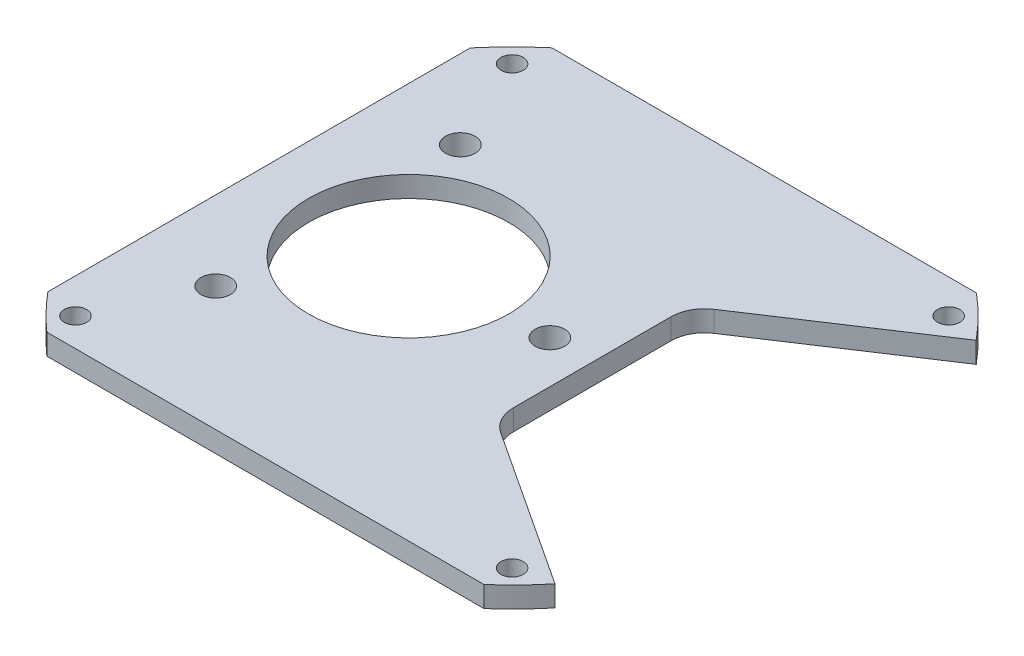
ISO-10303-21;
HEADER;
FILE_DESCRIPTION(('STEP AP214'),'2;1');
FILE_NAME('part.step','',(''),(''),'','','');
FILE_SCHEMA(('AUTOMOTIVE_DESIGN { 1 0 10303 214 1 1 1 1 }'));
ENDSEC;
DATA;
#1=APPLICATION_CONTEXT('core data for automotive mechanical design processes');
#2=APPLICATION_PROTOCOL_DEFINITION('international standard','automotive_design',2000,#1);
#3=PRODUCT_CONTEXT('',#1,'mechanical');
#4=PRODUCT('Part','Part','',(#3));
#5=PRODUCT_RELATED_PRODUCT_CATEGORY('part','',(#4));
#6=PRODUCT_DEFINITION_FORMATION('','',#4);
#7=PRODUCT_DEFINITION_CONTEXT('part definition',#1,'design');
#8=PRODUCT_DEFINITION('design','',#6,#7);
#9=PRODUCT_DEFINITION_SHAPE('','',#8);
#10=(LENGTH_UNIT() NAMED_UNIT(*) SI_UNIT(.MILLI.,.METRE.));
#11=(NAMED_UNIT(*) PLANE_ANGLE_UNIT() SI_UNIT($,.RADIAN.));
#12=(NAMED_UNIT(*) SI_UNIT($,.STERADIAN.) SOLID_ANGLE_UNIT());
#13=UNCERTAINTY_MEASURE_WITH_UNIT(LENGTH_MEASURE(1.E-05),#10,'distance_accuracy_value','');
#14=(GEOMETRIC_REPRESENTATION_CONTEXT(3) GLOBAL_UNCERTAINTY_ASSIGNED_CONTEXT((#13)) GLOBAL_UNIT_ASSIGNED_CONTEXT((#10,
#11,#12)) REPRESENTATION_CONTEXT('',''));
#15=CARTESIAN_POINT('',(0.,0.,0.));
#16=DIRECTION('',(0.,0.,1.));
#17=DIRECTION('',(1.,0.,0.));
#18=AXIS2_PLACEMENT_3D('',#15,#16,#17);
#19=CARTESIAN_POINT('',(0.,1.5875,0.));
#20=DIRECTION('',(0.,1.,0.));
#21=DIRECTION('',(0.,0.,1.));
#22=AXIS2_PLACEMENT_3D('',#19,#20,#21);
#23=PLANE('',#22);
#24=CARTESIAN_POINT('',(-26.4980000000001,1.5875,18.6195461813654));
#25=DIRECTION('',(0.,-1.,0.));
#26=DIRECTION('',(0.,0.,-1.));
#27=AXIS2_PLACEMENT_3D('',#24,#25,#26);
#28=CIRCLE('',#27,2.25);
#29=CARTESIAN_POINT('',(-26.4980000000001,1.5875,16.3695461813654));
#30=VERTEX_POINT('',#29);
#31=EDGE_CURVE('E280',#30,#30,#28,.T.);
#32=ORIENTED_EDGE('',*,*,#31,.T.);
#33=EDGE_LOOP('',(#32));
#34=FACE_BOUND('',#33,.T.);
#35=CARTESIAN_POINT('',(5.75200000000001,1.5875,0.));
#36=DIRECTION('',(0.,-1.,0.));
#37=DIRECTION('',(0.,0.,-1.));
#38=AXIS2_PLACEMENT_3D('',#35,#36,#37);
#39=CIRCLE('',#38,2.25);
#40=CARTESIAN_POINT('',(5.75200000000001,1.5875,-2.25));
#41=VERTEX_POINT('',#40);
#42=EDGE_CURVE('E274',#41,#41,#39,.T.);
#43=ORIENTED_EDGE('',*,*,#42,.T.);
#44=EDGE_LOOP('',(#43));
#45=FACE_BOUND('',#44,.T.);
#46=CARTESIAN_POINT('',(-33.2269476479559,1.5875,-33.2269476479559));
#47=DIRECTION('',(0.,1.,0.));
#48=DIRECTION('',(0.,0.,1.));
#49=AXIS2_PLACEMENT_3D('',#46,#47,#48);
#50=CIRCLE('',#49,1.7);
#51=CARTESIAN_POINT('',(-33.2269476479559,1.5875,-31.5269476479559));
#52=VERTEX_POINT('',#51);
#53=EDGE_CURVE('E271',#52,#52,#50,.T.);
#54=ORIENTED_EDGE('',*,*,#53,.F.);
#55=EDGE_LOOP('',(#54));
#56=FACE_BOUND('',#55,.T.);
#57=CARTESIAN_POINT('',(33.2269476479559,1.5875,-33.2269476479559));
#58=DIRECTION('',(0.,1.,0.));
#59=DIRECTION('',(0.,0.,1.));
#60=AXIS2_PLACEMENT_3D('',#57,#58,#59);
#61=CIRCLE('',#60,1.7);
#62=CARTESIAN_POINT('',(33.2269476479559,1.5875,-31.5269476479559));
#63=VERTEX_POINT('',#62);
#64=EDGE_CURVE('E265',#63,#63,#61,.T.);
#65=ORIENTED_EDGE('',*,*,#64,.F.);
#66=EDGE_LOOP('',(#65));
#67=FACE_BOUND('',#66,.T.);
#68=CARTESIAN_POINT('',(33.2269476479559,1.5875,33.2269476479559));
#69=DIRECTION('',(0.,1.,0.));
#70=DIRECTION('',(0.,0.,1.));
#71=AXIS2_PLACEMENT_3D('',#68,#69,#70);
#72=CIRCLE('',#71,1.7);
#73=CARTESIAN_POINT('',(33.2269476479559,1.5875,34.9269476479559));
#74=VERTEX_POINT('',#73);
#75=EDGE_CURVE('E259',#74,#74,#72,.T.);
#76=ORIENTED_EDGE('',*,*,#75,.F.);
#77=EDGE_LOOP('',(#76));
#78=FACE_BOUND('',#77,.T.);
#79=CARTESIAN_POINT('',(-33.2269476479559,1.5875,33.2269476479559));
#80=DIRECTION('',(0.,1.,0.));
#81=DIRECTION('',(0.,0.,1.));
#82=AXIS2_PLACEMENT_3D('',#79,#80,#81);
#83=CIRCLE('',#82,1.7);
#84=CARTESIAN_POINT('',(-33.2269476479559,1.5875,34.9269476479559));
#85=VERTEX_POINT('',#84);
#86=EDGE_CURVE('E253',#85,#85,#83,.T.);
#87=ORIENTED_EDGE('',*,*,#86,.F.);
#88=EDGE_LOOP('',(#87));
#89=FACE_BOUND('',#88,.T.);
#90=CARTESIAN_POINT('',(0.,1.5875,0.));
#91=DIRECTION('',(0.,1.,0.));
#92=DIRECTION('',(0.,0.,1.));
#93=AXIS2_PLACEMENT_3D('',#90,#91,#92);
#94=CIRCLE('',#93,50.165);
#95=CARTESIAN_POINT('',(-32.3185974565736,1.5875,-38.3671146092582));
#96=VERTEX_POINT('',#95);
#97=CARTESIAN_POINT('',(-38.5094748897854,1.5875,-32.1488346400455));
#98=VERTEX_POINT('',#97);
#99=EDGE_CURVE('E136',#96,#98,#94,.T.);
#100=ORIENTED_EDGE('',*,*,#99,.T.);
#101=DIRECTION('',(0.,0.,1.));
#102=VECTOR('',#101,1.);
#103=CARTESIAN_POINT('',(-38.5094748897854,1.5875,-32.1488346400455));
#104=LINE('',#103,#102);
#105=CARTESIAN_POINT('',(-38.5094748897854,1.5875,32.1488346400455));
#106=VERTEX_POINT('',#105);
#107=EDGE_CURVE('E125',#98,#106,#104,.T.);
#108=ORIENTED_EDGE('',*,*,#107,.T.);
#109=CARTESIAN_POINT('',(0.,1.5875,0.));
#110=DIRECTION('',(0.,1.,0.));
#111=DIRECTION('',(0.,0.,-1.));
#112=AXIS2_PLACEMENT_3D('',#109,#110,#111);
#113=CIRCLE('',#112,50.165);
#114=CARTESIAN_POINT('',(-33.274,1.5875,37.5415522987529));
#115=VERTEX_POINT('',#114);
#116=EDGE_CURVE('E135',#106,#115,#113,.T.);
#117=ORIENTED_EDGE('',*,*,#116,.T.);
#118=DIRECTION('',(1.,0.,0.));
#119=VECTOR('',#118,1.);
#120=CARTESIAN_POINT('',(-33.274,1.5875,37.5415522987529));
#121=LINE('',#120,#119);
#122=CARTESIAN_POINT('',(33.274,1.5875,37.5415522987529));
#123=VERTEX_POINT('',#122);
#124=EDGE_CURVE('E224',#115,#123,#121,.T.);
#125=ORIENTED_EDGE('',*,*,#124,.T.);
#126=CARTESIAN_POINT('',(0.,1.5875,0.));
#127=DIRECTION('',(0.,1.,0.));
#128=DIRECTION('',(0.,0.,-1.));
#129=AXIS2_PLACEMENT_3D('',#126,#127,#128);
#130=CIRCLE('',#129,50.165);
#131=CARTESIAN_POINT('',(38.5872719681109,1.5875,32.0554155652215));
#132=VERTEX_POINT('',#131);
#133=EDGE_CURVE('E241',#123,#132,#130,.T.);
#134=ORIENTED_EDGE('',*,*,#133,.T.);
#135=DIRECTION('',(-0.835913655809009,0.,-0.548860966030577));
#136=VECTOR('',#135,1.);
#137=CARTESIAN_POINT('',(12.2058503384121,1.5875,14.7333722413536));
#138=LINE('',#137,#136);
#139=CARTESIAN_POINT('',(14.4976366309768,1.5875,16.2381592845265));
#140=VERTEX_POINT('',#139);
#141=EDGE_CURVE('E239',#132,#140,#138,.T.);
#142=ORIENTED_EDGE('',*,*,#141,.T.);
#143=CARTESIAN_POINT('',(17.2858503384121,1.5875,11.9917179130167));
#144=DIRECTION('',(0.,1.,0.));
#145=DIRECTION('',(0.,0.,1.));
#146=AXIS2_PLACEMENT_3D('',#143,#144,#145);
#147=CIRCLE('',#146,5.08);
#148=CARTESIAN_POINT('',(12.2058503384121,1.5875,11.9917179130167));
#149=VERTEX_POINT('',#148);
#150=EDGE_CURVE('E11',#140,#149,#147,.F.);
#151=ORIENTED_EDGE('',*,*,#150,.T.);
#152=DIRECTION('',(0.,0.,-1.));
#153=VECTOR('',#152,1.);
#154=CARTESIAN_POINT('',(12.2058503384121,1.5875,-14.7333722413536));
#155=LINE('',#154,#153);
#156=CARTESIAN_POINT('',(12.2058503384121,1.5875,-11.9991267173508));
#157=VERTEX_POINT('',#156);
#158=EDGE_CURVE('E173',#149,#157,#155,.T.);
#159=ORIENTED_EDGE('',*,*,#158,.T.);
#160=CARTESIAN_POINT('',(17.2858503384121,1.5875,-11.9991267173508));
#161=DIRECTION('',(0.,1.,0.));
#162=DIRECTION('',(0.,0.,1.));
#163=AXIS2_PLACEMENT_3D('',#160,#161,#162);
#164=CIRCLE('',#163,5.08);
#165=CARTESIAN_POINT('',(14.488045631947,1.5875,-16.2392551145201));
#166=VERTEX_POINT('',#165);
#167=EDGE_CURVE('E166',#157,#166,#164,.F.);
#168=ORIENTED_EDGE('',*,*,#167,.T.);
#169=DIRECTION('',(0.834670944324663,0.,-0.550748957965583));
#170=VECTOR('',#169,1.);
#171=CARTESIAN_POINT('',(12.2058503384121,1.5875,-14.7333722413536));
#172=LINE('',#171,#170);
#173=CARTESIAN_POINT('',(38.5413694712102,1.5875,-32.1105911543788));
#174=VERTEX_POINT('',#173);
#175=EDGE_CURVE('E170',#166,#174,#172,.T.);
#176=ORIENTED_EDGE('',*,*,#175,.T.);
#177=CARTESIAN_POINT('',(0.,1.5875,0.));
#178=DIRECTION('',(0.,1.,0.));
#179=DIRECTION('',(0.,0.,1.));
#180=AXIS2_PLACEMENT_3D('',#177,#178,#179);
#181=CIRCLE('',#180,50.165);
#182=CARTESIAN_POINT('',(32.3185974565736,1.5875,-38.3671146092582));
#183=VERTEX_POINT('',#182);
#184=EDGE_CURVE('E183',#174,#183,#181,.T.);
#185=ORIENTED_EDGE('',*,*,#184,.T.);
#186=DIRECTION('',(-1.,0.,0.));
#187=VECTOR('',#186,1.);
#188=CARTESIAN_POINT('',(-32.3185974565736,1.5875,-38.3671146092582));
#189=LINE('',#188,#187);
#190=EDGE_CURVE('E141',#183,#96,#189,.T.);
#191=ORIENTED_EDGE('',*,*,#190,.T.);
#192=EDGE_LOOP('',(#100,#108,#117,#125,#134,#142,#151,#159,#168,#176,#185,#191));
#193=FACE_BOUND('',#192,.T.);
#194=CARTESIAN_POINT('',(-15.748,1.5875,0.));
#195=DIRECTION('',(0.,1.,0.));
#196=DIRECTION('',(0.,0.,1.));
#197=AXIS2_PLACEMENT_3D('',#194,#195,#196);
#198=CIRCLE('',#197,15.24);
#199=CARTESIAN_POINT('',(-15.748,1.5875,15.24));
#200=VERTEX_POINT('',#199);
#201=EDGE_CURVE('E235',#200,#200,#198,.T.);
#202=ORIENTED_EDGE('',*,*,#201,.F.);
#203=EDGE_LOOP('',(#202));
#204=FACE_BOUND('',#203,.T.);
#205=CARTESIAN_POINT('',(-26.4979999999998,1.5875,-18.6195461813655));
#206=DIRECTION('',(0.,-1.,0.));
#207=DIRECTION('',(0.,0.,-1.));
#208=AXIS2_PLACEMENT_3D('',#205,#206,#207);
#209=CIRCLE('',#208,2.25);
#210=CARTESIAN_POINT('',(-26.4979999999998,1.5875,-20.8695461813655));
#211=VERTEX_POINT('',#210);
#212=EDGE_CURVE('E286',#211,#211,#209,.T.);
#213=ORIENTED_EDGE('',*,*,#212,.T.);
#214=EDGE_LOOP('',(#213));
#215=FACE_BOUND('',#214,.T.);
#216=ADVANCED_FACE('F36',(#34,#45,#56,#67,#78,#89,#193,#204,#215),#23,.T.);
#217=CARTESIAN_POINT('',(0.,-1.5875,0.));
#218=DIRECTION('',(0.,1.,0.));
#219=DIRECTION('',(0.,0.,1.));
#220=AXIS2_PLACEMENT_3D('',#217,#218,#219);
#221=PLANE('',#220);
#222=CARTESIAN_POINT('',(5.75200000000001,-1.5875,0.));
#223=DIRECTION('',(0.,-1.,0.));
#224=DIRECTION('',(0.,0.,-1.));
#225=AXIS2_PLACEMENT_3D('',#222,#223,#224);
#226=CIRCLE('',#225,2.24999999999999);
#227=CARTESIAN_POINT('',(5.75200000000001,-1.5875,-2.24999999999999));
#228=VERTEX_POINT('',#227);
#229=EDGE_CURVE('E277',#228,#228,#226,.T.);
#230=ORIENTED_EDGE('',*,*,#229,.F.);
#231=EDGE_LOOP('',(#230));
#232=FACE_BOUND('',#231,.T.);
#233=CARTESIAN_POINT('',(-33.2269476479559,-1.5875,-33.2269476479559));
#234=DIRECTION('',(0.,1.,0.));
#235=DIRECTION('',(0.,0.,1.));
#236=AXIS2_PLACEMENT_3D('',#233,#234,#235);
#237=CIRCLE('',#236,1.7);
#238=CARTESIAN_POINT('',(-33.2269476479559,-1.5875,-31.5269476479559));
#239=VERTEX_POINT('',#238);
#240=EDGE_CURVE('E268',#239,#239,#237,.T.);
#241=ORIENTED_EDGE('',*,*,#240,.T.);
#242=EDGE_LOOP('',(#241));
#243=FACE_BOUND('',#242,.T.);
#244=CARTESIAN_POINT('',(33.2269476479559,-1.5875,-33.2269476479559));
#245=DIRECTION('',(0.,1.,0.));
#246=DIRECTION('',(0.,0.,1.));
#247=AXIS2_PLACEMENT_3D('',#244,#245,#246);
#248=CIRCLE('',#247,1.7);
#249=CARTESIAN_POINT('',(33.2269476479559,-1.5875,-31.5269476479559));
#250=VERTEX_POINT('',#249);
#251=EDGE_CURVE('E262',#250,#250,#248,.T.);
#252=ORIENTED_EDGE('',*,*,#251,.T.);
#253=EDGE_LOOP('',(#252));
#254=FACE_BOUND('',#253,.T.);
#255=CARTESIAN_POINT('',(33.2269476479559,-1.5875,33.2269476479559));
#256=DIRECTION('',(0.,1.,0.));
#257=DIRECTION('',(0.,0.,1.));
#258=AXIS2_PLACEMENT_3D('',#255,#256,#257);
#259=CIRCLE('',#258,1.7);
#260=CARTESIAN_POINT('',(33.2269476479559,-1.5875,34.9269476479559));
#261=VERTEX_POINT('',#260);
#262=EDGE_CURVE('E256',#261,#261,#259,.T.);
#263=ORIENTED_EDGE('',*,*,#262,.T.);
#264=EDGE_LOOP('',(#263));
#265=FACE_BOUND('',#264,.T.);
#266=CARTESIAN_POINT('',(-33.2269476479559,-1.5875,33.2269476479559));
#267=DIRECTION('',(0.,1.,0.));
#268=DIRECTION('',(0.,0.,1.));
#269=AXIS2_PLACEMENT_3D('',#266,#267,#268);
#270=CIRCLE('',#269,1.7);
#271=CARTESIAN_POINT('',(-33.2269476479559,-1.5875,34.9269476479559));
#272=VERTEX_POINT('',#271);
#273=EDGE_CURVE('E248',#272,#272,#270,.T.);
#274=ORIENTED_EDGE('',*,*,#273,.T.);
#275=EDGE_LOOP('',(#274));
#276=FACE_BOUND('',#275,.T.);
#277=CARTESIAN_POINT('',(0.,-1.5875,0.));
#278=DIRECTION('',(0.,1.,0.));
#279=DIRECTION('',(0.,0.,1.));
#280=AXIS2_PLACEMENT_3D('',#277,#278,#279);
#281=CIRCLE('',#280,50.165);
#282=CARTESIAN_POINT('',(-32.3185974565736,-1.5875,-38.3671146092582));
#283=VERTEX_POINT('',#282);
#284=CARTESIAN_POINT('',(-38.5094748897854,-1.5875,-32.1488346400455));
#285=VERTEX_POINT('',#284);
#286=EDGE_CURVE('E149',#283,#285,#281,.T.);
#287=ORIENTED_EDGE('',*,*,#286,.F.);
#288=DIRECTION('',(-1.,0.,0.));
#289=VECTOR('',#288,1.);
#290=CARTESIAN_POINT('',(-32.3185974565736,-1.5875,-38.3671146092582));
#291=LINE('',#290,#289);
#292=CARTESIAN_POINT('',(32.3185974565736,-1.5875,-38.3671146092582));
#293=VERTEX_POINT('',#292);
#294=EDGE_CURVE('E145',#293,#283,#291,.T.);
#295=ORIENTED_EDGE('',*,*,#294,.F.);
#296=CARTESIAN_POINT('',(0.,-1.5875,0.));
#297=DIRECTION('',(0.,1.,0.));
#298=DIRECTION('',(0.,0.,1.));
#299=AXIS2_PLACEMENT_3D('',#296,#297,#298);
#300=CIRCLE('',#299,50.165);
#301=CARTESIAN_POINT('',(38.5413694712102,-1.5875,-32.1105911543788));
#302=VERTEX_POINT('',#301);
#303=EDGE_CURVE('E197',#302,#293,#300,.T.);
#304=ORIENTED_EDGE('',*,*,#303,.F.);
#305=DIRECTION('',(0.834670944324663,0.,-0.550748957965583));
#306=VECTOR('',#305,1.);
#307=CARTESIAN_POINT('',(12.2058503384121,-1.5875,-14.7333722413536));
#308=LINE('',#307,#306);
#309=CARTESIAN_POINT('',(14.488045631947,-1.5875,-16.2392551145201));
#310=VERTEX_POINT('',#309);
#311=EDGE_CURVE('E191',#310,#302,#308,.T.);
#312=ORIENTED_EDGE('',*,*,#311,.F.);
#313=CARTESIAN_POINT('',(17.2858503384121,-1.5875,-11.9991267173508));
#314=DIRECTION('',(0.,1.,0.));
#315=DIRECTION('',(0.,0.,1.));
#316=AXIS2_PLACEMENT_3D('',#313,#314,#315);
#317=CIRCLE('',#316,5.08);
#318=CARTESIAN_POINT('',(12.2058503384121,-1.5875,-11.9991267173508));
#319=VERTEX_POINT('',#318);
#320=EDGE_CURVE('E164',#310,#319,#317,.T.);
#321=ORIENTED_EDGE('',*,*,#320,.T.);
#322=DIRECTION('',(0.,0.,-1.));
#323=VECTOR('',#322,1.);
#324=CARTESIAN_POINT('',(12.2058503384121,-1.5875,-14.7333722413536));
#325=LINE('',#324,#323);
#326=CARTESIAN_POINT('',(12.2058503384121,-1.5875,11.9917179130167));
#327=VERTEX_POINT('',#326);
#328=EDGE_CURVE('E189',#327,#319,#325,.T.);
#329=ORIENTED_EDGE('',*,*,#328,.F.);
#330=CARTESIAN_POINT('',(17.2858503384121,-1.5875,11.9917179130167));
#331=DIRECTION('',(0.,1.,0.));
#332=DIRECTION('',(0.,0.,1.));
#333=AXIS2_PLACEMENT_3D('',#330,#331,#332);
#334=CIRCLE('',#333,5.08);
#335=CARTESIAN_POINT('',(14.4976366309768,-1.5875,16.2381592845265));
#336=VERTEX_POINT('',#335);
#337=EDGE_CURVE('E44',#327,#336,#334,.T.);
#338=ORIENTED_EDGE('',*,*,#337,.T.);
#339=DIRECTION('',(-0.835913655809009,0.,-0.548860966030577));
#340=VECTOR('',#339,1.);
#341=CARTESIAN_POINT('',(12.2058503384121,-1.5875,14.7333722413536));
#342=LINE('',#341,#340);
#343=CARTESIAN_POINT('',(38.5872719681109,-1.5875,32.0554155652215));
#344=VERTEX_POINT('',#343);
#345=EDGE_CURVE('E195',#344,#336,#342,.T.);
#346=ORIENTED_EDGE('',*,*,#345,.F.);
#347=CARTESIAN_POINT('',(0.,-1.5875,0.));
#348=DIRECTION('',(0.,1.,0.));
#349=DIRECTION('',(0.,0.,-1.));
#350=AXIS2_PLACEMENT_3D('',#347,#348,#349);
#351=CIRCLE('',#350,50.165);
#352=CARTESIAN_POINT('',(33.274,-1.5875,37.5415522987529));
#353=VERTEX_POINT('',#352);
#354=EDGE_CURVE('E199',#353,#344,#351,.T.);
#355=ORIENTED_EDGE('',*,*,#354,.F.);
#356=DIRECTION('',(1.,0.,0.));
#357=VECTOR('',#356,1.);
#358=CARTESIAN_POINT('',(-33.274,-1.5875,37.5415522987529));
#359=LINE('',#358,#357);
#360=CARTESIAN_POINT('',(-33.274,-1.5875,37.5415522987529));
#361=VERTEX_POINT('',#360);
#362=EDGE_CURVE('E223',#361,#353,#359,.T.);
#363=ORIENTED_EDGE('',*,*,#362,.F.);
#364=CARTESIAN_POINT('',(0.,-1.5875,0.));
#365=DIRECTION('',(0.,1.,0.));
#366=DIRECTION('',(0.,0.,-1.));
#367=AXIS2_PLACEMENT_3D('',#364,#365,#366);
#368=CIRCLE('',#367,50.165);
#369=CARTESIAN_POINT('',(-38.5094748897854,-1.5875,32.1488346400455));
#370=VERTEX_POINT('',#369);
#371=EDGE_CURVE('E228',#370,#361,#368,.T.);
#372=ORIENTED_EDGE('',*,*,#371,.F.);
#373=DIRECTION('',(0.,0.,1.));
#374=VECTOR('',#373,1.);
#375=CARTESIAN_POINT('',(-38.5094748897854,-1.5875,-32.1488346400455));
#376=LINE('',#375,#374);
#377=EDGE_CURVE('E230',#285,#370,#376,.T.);
#378=ORIENTED_EDGE('',*,*,#377,.F.);
#379=EDGE_LOOP('',(#287,#295,#304,#312,#321,#329,#338,#346,#355,#363,#372,#378));
#380=FACE_BOUND('',#379,.T.);
#381=CARTESIAN_POINT('',(-15.748,-1.5875,0.));
#382=DIRECTION('',(0.,1.,0.));
#383=DIRECTION('',(0.,0.,1.));
#384=AXIS2_PLACEMENT_3D('',#381,#382,#383);
#385=CIRCLE('',#384,15.24);
#386=CARTESIAN_POINT('',(-15.748,-1.5875,15.24));
#387=VERTEX_POINT('',#386);
#388=EDGE_CURVE('E245',#387,#387,#385,.T.);
#389=ORIENTED_EDGE('',*,*,#388,.T.);
#390=EDGE_LOOP('',(#389));
#391=FACE_BOUND('',#390,.T.);
#392=CARTESIAN_POINT('',(-26.4980000000001,-1.5875,18.6195461813654));
#393=DIRECTION('',(0.,-1.,0.));
#394=DIRECTION('',(0.,0.,-1.));
#395=AXIS2_PLACEMENT_3D('',#392,#393,#394);
#396=CIRCLE('',#395,2.24999999999999);
#397=CARTESIAN_POINT('',(-26.4980000000001,-1.5875,16.3695461813654));
#398=VERTEX_POINT('',#397);
#399=EDGE_CURVE('E283',#398,#398,#396,.T.);
#400=ORIENTED_EDGE('',*,*,#399,.F.);
#401=EDGE_LOOP('',(#400));
#402=FACE_BOUND('',#401,.T.);
#403=CARTESIAN_POINT('',(-26.4979999999998,-1.5875,-18.6195461813655));
#404=DIRECTION('',(0.,-1.,0.));
#405=DIRECTION('',(0.,0.,-1.));
#406=AXIS2_PLACEMENT_3D('',#403,#404,#405);
#407=CIRCLE('',#406,2.24999999999999);
#408=CARTESIAN_POINT('',(-26.4979999999998,-1.5875,-20.8695461813655));
#409=VERTEX_POINT('',#408);
#410=EDGE_CURVE('E289',#409,#409,#407,.T.);
#411=ORIENTED_EDGE('',*,*,#410,.F.);
#412=EDGE_LOOP('',(#411));
#413=FACE_BOUND('',#412,.T.);
#414=ADVANCED_FACE('F187',(#232,#243,#254,#265,#276,#380,#391,#402,#413),#221,.F.);
#415=CARTESIAN_POINT('',(0.,1.5875,0.));
#416=DIRECTION('',(0.,-1.,0.));
#417=DIRECTION('',(0.,0.,-1.));
#418=AXIS2_PLACEMENT_3D('',#415,#416,#417);
#419=CYLINDRICAL_SURFACE('',#418,50.165);
#420=ORIENTED_EDGE('',*,*,#286,.T.);
#421=DIRECTION('',(0.,-1.,0.));
#422=VECTOR('',#421,1.);
#423=CARTESIAN_POINT('',(-38.5094748897854,1.5875,-32.1488346400455));
#424=LINE('',#423,#422);
#425=EDGE_CURVE('E129',#98,#285,#424,.T.);
#426=ORIENTED_EDGE('',*,*,#425,.F.);
#427=ORIENTED_EDGE('',*,*,#99,.F.);
#428=DIRECTION('',(0.,-1.,0.));
#429=VECTOR('',#428,1.);
#430=CARTESIAN_POINT('',(-32.3185974565736,1.5875,-38.3671146092582));
#431=LINE('',#430,#429);
#432=EDGE_CURVE('E205',#96,#283,#431,.T.);
#433=ORIENTED_EDGE('',*,*,#432,.T.);
#434=EDGE_LOOP('',(#420,#426,#427,#433));
#435=FACE_BOUND('',#434,.T.);
#436=ADVANCED_FACE('F147',(#435),#419,.T.);
#437=CARTESIAN_POINT('',(-38.5094748897854,1.5875,-32.1488346400455));
#438=DIRECTION('',(1.,0.,0.));
#439=DIRECTION('',(0.,0.,-1.));
#440=AXIS2_PLACEMENT_3D('',#437,#438,#439);
#441=PLANE('',#440);
#442=ORIENTED_EDGE('',*,*,#377,.T.);
#443=DIRECTION('',(0.,-1.,0.));
#444=VECTOR('',#443,1.);
#445=CARTESIAN_POINT('',(-38.5094748897854,1.5875,32.1488346400455));
#446=LINE('',#445,#444);
#447=EDGE_CURVE('E132',#106,#370,#446,.T.);
#448=ORIENTED_EDGE('',*,*,#447,.F.);
#449=ORIENTED_EDGE('',*,*,#107,.F.);
#450=ORIENTED_EDGE('',*,*,#425,.T.);
#451=EDGE_LOOP('',(#442,#448,#449,#450));
#452=FACE_BOUND('',#451,.T.);
#453=ADVANCED_FACE('F127',(#452),#441,.F.);
#454=CARTESIAN_POINT('',(0.,1.5875,0.));
#455=DIRECTION('',(0.,-1.,0.));
#456=DIRECTION('',(0.,0.,-1.));
#457=AXIS2_PLACEMENT_3D('',#454,#455,#456);
#458=CYLINDRICAL_SURFACE('',#457,50.165);
#459=ORIENTED_EDGE('',*,*,#371,.T.);
#460=DIRECTION('',(0.,-1.,0.));
#461=VECTOR('',#460,1.);
#462=CARTESIAN_POINT('',(-33.274,1.5875,37.5415522987529));
#463=LINE('',#462,#461);
#464=EDGE_CURVE('E155',#115,#361,#463,.T.);
#465=ORIENTED_EDGE('',*,*,#464,.F.);
#466=ORIENTED_EDGE('',*,*,#116,.F.);
#467=ORIENTED_EDGE('',*,*,#447,.T.);
#468=EDGE_LOOP('',(#459,#465,#466,#467));
#469=FACE_BOUND('',#468,.T.);
#470=ADVANCED_FACE('F331',(#469),#458,.T.);
#471=CARTESIAN_POINT('',(-33.274,1.5875,37.5415522987529));
#472=DIRECTION('',(0.,0.,-1.));
#473=DIRECTION('',(-1.,0.,0.));
#474=AXIS2_PLACEMENT_3D('',#471,#472,#473);
#475=PLANE('',#474);
#476=ORIENTED_EDGE('',*,*,#362,.T.);
#477=DIRECTION('',(0.,-1.,0.));
#478=VECTOR('',#477,1.);
#479=CARTESIAN_POINT('',(33.274,1.5875,37.5415522987529));
#480=LINE('',#479,#478);
#481=EDGE_CURVE('E214',#123,#353,#480,.T.);
#482=ORIENTED_EDGE('',*,*,#481,.F.);
#483=ORIENTED_EDGE('',*,*,#124,.F.);
#484=ORIENTED_EDGE('',*,*,#464,.T.);
#485=EDGE_LOOP('',(#476,#482,#483,#484));
#486=FACE_BOUND('',#485,.T.);
#487=ADVANCED_FACE('F221',(#486),#475,.F.);
#488=CARTESIAN_POINT('',(0.,1.5875,0.));
#489=DIRECTION('',(0.,-1.,0.));
#490=DIRECTION('',(0.,0.,-1.));
#491=AXIS2_PLACEMENT_3D('',#488,#489,#490);
#492=CYLINDRICAL_SURFACE('',#491,50.165);
#493=ORIENTED_EDGE('',*,*,#354,.T.);
#494=DIRECTION('',(0.,-1.,0.));
#495=VECTOR('',#494,1.);
#496=CARTESIAN_POINT('',(38.5872719681109,1.5875,32.0554155652215));
#497=LINE('',#496,#495);
#498=EDGE_CURVE('E211',#132,#344,#497,.T.);
#499=ORIENTED_EDGE('',*,*,#498,.F.);
#500=ORIENTED_EDGE('',*,*,#133,.F.);
#501=ORIENTED_EDGE('',*,*,#481,.T.);
#502=EDGE_LOOP('',(#493,#499,#500,#501));
#503=FACE_BOUND('',#502,.T.);
#504=ADVANCED_FACE('F325',(#503),#492,.T.);
#505=CARTESIAN_POINT('',(12.2058503384121,1.5875,14.7333722413536));
#506=DIRECTION('',(-0.548860966030577,0.,0.835913655809008));
#507=DIRECTION('',(0.835913655809009,0.,0.548860966030577));
#508=AXIS2_PLACEMENT_3D('',#505,#506,#507);
#509=PLANE('',#508);
#510=ORIENTED_EDGE('',*,*,#345,.T.);
#511=DIRECTION('',(0.,-1.,0.));
#512=VECTOR('',#511,1.);
#513=CARTESIAN_POINT('',(14.4976366309768,1.5875,16.2381592845265));
#514=LINE('',#513,#512);
#515=EDGE_CURVE('E51',#336,#140,#514,.F.);
#516=ORIENTED_EDGE('',*,*,#515,.T.);
#517=ORIENTED_EDGE('',*,*,#141,.F.);
#518=ORIENTED_EDGE('',*,*,#498,.T.);
#519=EDGE_LOOP('',(#510,#516,#517,#518));
#520=FACE_BOUND('',#519,.T.);
#521=ADVANCED_FACE('F322',(#520),#509,.F.);
#522=CARTESIAN_POINT('',(12.2058503384121,1.5875,-14.7333722413536));
#523=DIRECTION('',(-1.,0.,0.));
#524=DIRECTION('',(0.,0.,1.));
#525=AXIS2_PLACEMENT_3D('',#522,#523,#524);
#526=PLANE('',#525);
#527=ORIENTED_EDGE('',*,*,#328,.T.);
#528=DIRECTION('',(0.,-1.,0.));
#529=VECTOR('',#528,1.);
#530=CARTESIAN_POINT('',(12.2058503384121,1.5875,-11.9991267173508));
#531=LINE('',#530,#529);
#532=EDGE_CURVE('E161',#319,#157,#531,.F.);
#533=ORIENTED_EDGE('',*,*,#532,.T.);
#534=ORIENTED_EDGE('',*,*,#158,.F.);
#535=DIRECTION('',(0.,-1.,0.));
#536=VECTOR('',#535,1.);
#537=CARTESIAN_POINT('',(12.2058503384121,-1.5875,11.9917179130167));
#538=LINE('',#537,#536);
#539=EDGE_CURVE('E153',#149,#327,#538,.T.);
#540=ORIENTED_EDGE('',*,*,#539,.T.);
#541=EDGE_LOOP('',(#527,#533,#534,#540));
#542=FACE_BOUND('',#541,.T.);
#543=ADVANCED_FACE('F193',(#542),#526,.F.);
#544=CARTESIAN_POINT('',(12.2058503384121,1.5875,-14.7333722413536));
#545=DIRECTION('',(-0.550748957965583,0.,-0.834670944324663));
#546=DIRECTION('',(-0.834670944324663,0.,0.550748957965583));
#547=AXIS2_PLACEMENT_3D('',#544,#545,#546);
#548=PLANE('',#547);
#549=ORIENTED_EDGE('',*,*,#175,.F.);
#550=DIRECTION('',(0.,-1.,0.));
#551=VECTOR('',#550,1.);
#552=CARTESIAN_POINT('',(14.488045631947,-1.5875,-16.2392551145201));
#553=LINE('',#552,#551);
#554=EDGE_CURVE('E150',#166,#310,#553,.T.);
#555=ORIENTED_EDGE('',*,*,#554,.T.);
#556=ORIENTED_EDGE('',*,*,#311,.T.);
#557=DIRECTION('',(0.,-1.,0.));
#558=VECTOR('',#557,1.);
#559=CARTESIAN_POINT('',(38.5413694712102,1.5875,-32.1105911543788));
#560=LINE('',#559,#558);
#561=EDGE_CURVE('E181',#174,#302,#560,.T.);
#562=ORIENTED_EDGE('',*,*,#561,.F.);
#563=EDGE_LOOP('',(#549,#555,#556,#562));
#564=FACE_BOUND('',#563,.T.);
#565=ADVANCED_FACE('F178',(#564),#548,.F.);
#566=CARTESIAN_POINT('',(0.,1.5875,0.));
#567=DIRECTION('',(0.,-1.,0.));
#568=DIRECTION('',(0.,0.,-1.));
#569=AXIS2_PLACEMENT_3D('',#566,#567,#568);
#570=CYLINDRICAL_SURFACE('',#569,50.165);
#571=ORIENTED_EDGE('',*,*,#303,.T.);
#572=DIRECTION('',(0.,-1.,0.));
#573=VECTOR('',#572,1.);
#574=CARTESIAN_POINT('',(32.3185974565736,1.5875,-38.3671146092582));
#575=LINE('',#574,#573);
#576=EDGE_CURVE('E207',#183,#293,#575,.T.);
#577=ORIENTED_EDGE('',*,*,#576,.F.);
#578=ORIENTED_EDGE('',*,*,#184,.F.);
#579=ORIENTED_EDGE('',*,*,#561,.T.);
#580=EDGE_LOOP('',(#571,#577,#578,#579));
#581=FACE_BOUND('',#580,.T.);
#582=ADVANCED_FACE('F313',(#581),#570,.T.);
#583=CARTESIAN_POINT('',(-32.3185974565736,1.5875,-38.3671146092582));
#584=DIRECTION('',(0.,0.,1.));
#585=DIRECTION('',(1.,0.,0.));
#586=AXIS2_PLACEMENT_3D('',#583,#584,#585);
#587=PLANE('',#586);
#588=ORIENTED_EDGE('',*,*,#294,.T.);
#589=ORIENTED_EDGE('',*,*,#432,.F.);
#590=ORIENTED_EDGE('',*,*,#190,.F.);
#591=ORIENTED_EDGE('',*,*,#576,.T.);
#592=EDGE_LOOP('',(#588,#589,#590,#591));
#593=FACE_BOUND('',#592,.T.);
#594=ADVANCED_FACE('F309',(#593),#587,.F.);
#595=CARTESIAN_POINT('',(-15.748,1.5875,0.));
#596=DIRECTION('',(0.,-1.,0.));
#597=DIRECTION('',(0.,0.,-1.));
#598=AXIS2_PLACEMENT_3D('',#595,#596,#597);
#599=CYLINDRICAL_SURFACE('',#598,15.24);
#600=ORIENTED_EDGE('',*,*,#201,.T.);
#601=EDGE_LOOP('',(#600));
#602=FACE_BOUND('',#601,.T.);
#603=ORIENTED_EDGE('',*,*,#388,.F.);
#604=EDGE_LOOP('',(#603));
#605=FACE_BOUND('',#604,.T.);
#606=ADVANCED_FACE('F312',(#602,#605),#599,.F.);
#607=CARTESIAN_POINT('',(-33.2269476479559,1.5875,33.2269476479559));
#608=DIRECTION('',(0.,1.,0.));
#609=DIRECTION('',(0.,0.,1.));
#610=AXIS2_PLACEMENT_3D('',#607,#608,#609);
#611=CYLINDRICAL_SURFACE('',#610,1.7);
#612=ORIENTED_EDGE('',*,*,#273,.F.);
#613=EDGE_LOOP('',(#612));
#614=FACE_BOUND('',#613,.T.);
#615=ORIENTED_EDGE('',*,*,#86,.T.);
#616=EDGE_LOOP('',(#615));
#617=FACE_BOUND('',#616,.T.);
#618=ADVANCED_FACE('F359',(#614,#617),#611,.F.);
#619=CARTESIAN_POINT('',(33.2269476479559,1.5875,33.2269476479559));
#620=DIRECTION('',(0.,1.,0.));
#621=DIRECTION('',(0.,0.,1.));
#622=AXIS2_PLACEMENT_3D('',#619,#620,#621);
#623=CYLINDRICAL_SURFACE('',#622,1.7);
#624=ORIENTED_EDGE('',*,*,#262,.F.);
#625=EDGE_LOOP('',(#624));
#626=FACE_BOUND('',#625,.T.);
#627=ORIENTED_EDGE('',*,*,#75,.T.);
#628=EDGE_LOOP('',(#627));
#629=FACE_BOUND('',#628,.T.);
#630=ADVANCED_FACE('F349',(#626,#629),#623,.F.);
#631=CARTESIAN_POINT('',(33.2269476479559,1.5875,-33.2269476479559));
#632=DIRECTION('',(0.,1.,0.));
#633=DIRECTION('',(0.,0.,1.));
#634=AXIS2_PLACEMENT_3D('',#631,#632,#633);
#635=CYLINDRICAL_SURFACE('',#634,1.7);
#636=ORIENTED_EDGE('',*,*,#251,.F.);
#637=EDGE_LOOP('',(#636));
#638=FACE_BOUND('',#637,.T.);
#639=ORIENTED_EDGE('',*,*,#64,.T.);
#640=EDGE_LOOP('',(#639));
#641=FACE_BOUND('',#640,.T.);
#642=ADVANCED_FACE('F343',(#638,#641),#635,.F.);
#643=CARTESIAN_POINT('',(-33.2269476479559,1.5875,-33.2269476479559));
#644=DIRECTION('',(0.,1.,0.));
#645=DIRECTION('',(0.,0.,1.));
#646=AXIS2_PLACEMENT_3D('',#643,#644,#645);
#647=CYLINDRICAL_SURFACE('',#646,1.7);
#648=ORIENTED_EDGE('',*,*,#240,.F.);
#649=EDGE_LOOP('',(#648));
#650=FACE_BOUND('',#649,.T.);
#651=ORIENTED_EDGE('',*,*,#53,.T.);
#652=EDGE_LOOP('',(#651));
#653=FACE_BOUND('',#652,.T.);
#654=ADVANCED_FACE('F336',(#650,#653),#647,.F.);
#655=CARTESIAN_POINT('',(17.2858503384121,1.5875,-11.9991267173508));
#656=DIRECTION('',(0.,1.,0.));
#657=DIRECTION('',(0.,0.,1.));
#658=AXIS2_PLACEMENT_3D('',#655,#656,#657);
#659=CYLINDRICAL_SURFACE('',#658,5.08);
#660=ORIENTED_EDGE('',*,*,#167,.F.);
#661=ORIENTED_EDGE('',*,*,#532,.F.);
#662=ORIENTED_EDGE('',*,*,#320,.F.);
#663=ORIENTED_EDGE('',*,*,#554,.F.);
#664=EDGE_LOOP('',(#660,#661,#662,#663));
#665=FACE_BOUND('',#664,.T.);
#666=ADVANCED_FACE('F185',(#665),#659,.F.);
#667=CARTESIAN_POINT('',(17.2858503384121,1.5875,11.9917179130167));
#668=DIRECTION('',(0.,1.,0.));
#669=DIRECTION('',(0.,0.,1.));
#670=AXIS2_PLACEMENT_3D('',#667,#668,#669);
#671=CYLINDRICAL_SURFACE('',#670,5.08);
#672=ORIENTED_EDGE('',*,*,#150,.F.);
#673=ORIENTED_EDGE('',*,*,#515,.F.);
#674=ORIENTED_EDGE('',*,*,#337,.F.);
#675=ORIENTED_EDGE('',*,*,#539,.F.);
#676=EDGE_LOOP('',(#672,#673,#674,#675));
#677=FACE_BOUND('',#676,.T.);
#678=ADVANCED_FACE('F38',(#677),#671,.F.);
#679=CARTESIAN_POINT('',(5.75200000000001,-1.5875,0.));
#680=DIRECTION('',(0.,-1.,0.));
#681=DIRECTION('',(0.,0.,-1.));
#682=AXIS2_PLACEMENT_3D('',#679,#680,#681);
#683=CYLINDRICAL_SURFACE('',#682,2.24999999999999);
#684=ORIENTED_EDGE('',*,*,#42,.F.);
#685=EDGE_LOOP('',(#684));
#686=FACE_BOUND('',#685,.T.);
#687=ORIENTED_EDGE('',*,*,#229,.T.);
#688=EDGE_LOOP('',(#687));
#689=FACE_BOUND('',#688,.T.);
#690=ADVANCED_FACE('F341',(#686,#689),#683,.F.);
#691=CARTESIAN_POINT('',(-26.4980000000001,-1.5875,18.6195461813654));
#692=DIRECTION('',(0.,-1.,0.));
#693=DIRECTION('',(0.,0.,-1.));
#694=AXIS2_PLACEMENT_3D('',#691,#692,#693);
#695=CYLINDRICAL_SURFACE('',#694,2.24999999999999);
#696=ORIENTED_EDGE('',*,*,#31,.F.);
#697=EDGE_LOOP('',(#696));
#698=FACE_BOUND('',#697,.T.);
#699=ORIENTED_EDGE('',*,*,#399,.T.);
#700=EDGE_LOOP('',(#699));
#701=FACE_BOUND('',#700,.T.);
#702=ADVANCED_FACE('F373',(#698,#701),#695,.F.);
#703=CARTESIAN_POINT('',(-26.4979999999998,-1.5875,-18.6195461813655));
#704=DIRECTION('',(0.,-1.,0.));
#705=DIRECTION('',(0.,0.,-1.));
#706=AXIS2_PLACEMENT_3D('',#703,#704,#705);
#707=CYLINDRICAL_SURFACE('',#706,2.24999999999999);
#708=ORIENTED_EDGE('',*,*,#212,.F.);
#709=EDGE_LOOP('',(#708));
#710=FACE_BOUND('',#709,.T.);
#711=ORIENTED_EDGE('',*,*,#410,.T.);
#712=EDGE_LOOP('',(#711));
#713=FACE_BOUND('',#712,.T.);
#714=ADVANCED_FACE('F293',(#710,#713),#707,.F.);
#715=CLOSED_SHELL('',(#216,#414,#436,#453,#470,#487,#504,#521,#543,#565,#582,#594,#606,#618,
#630,#642,#654,#666,#678,#690,#702,#714));
#716=MANIFOLD_SOLID_BREP('B2',#715);
#717=ADVANCED_BREP_SHAPE_REPRESENTATION('',(#18,#716),#14);
#718=SHAPE_DEFINITION_REPRESENTATION(#9,#717);
ENDSEC;
END-ISO-10303-21;
